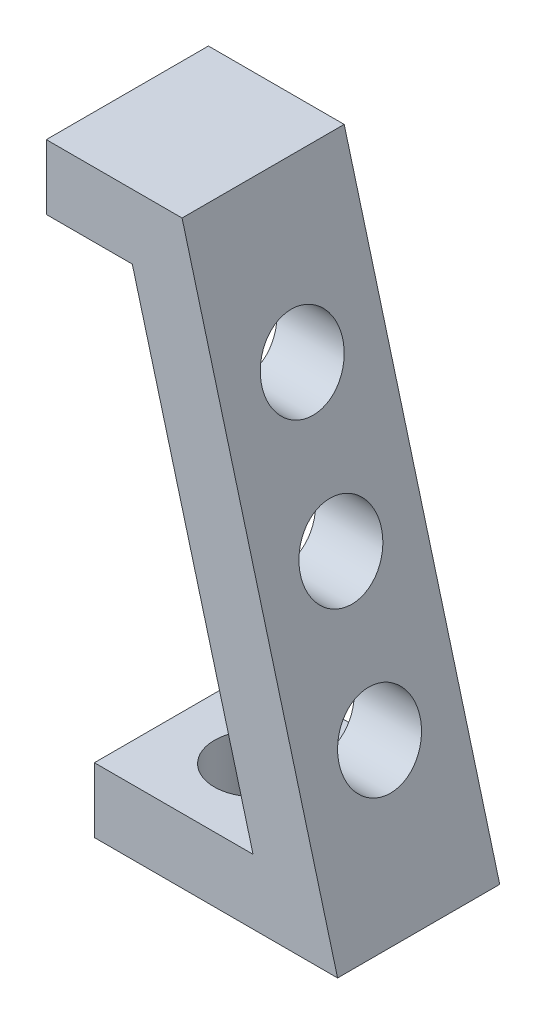
ISO-10303-21;
HEADER;
FILE_DESCRIPTION(('STEP AP214'),'2;1');
FILE_NAME('part.step','',(''),(''),'','','');
FILE_SCHEMA(('AUTOMOTIVE_DESIGN { 1 0 10303 214 1 1 1 1 }'));
ENDSEC;
DATA;
#1=APPLICATION_CONTEXT('core data for automotive mechanical design processes');
#2=APPLICATION_PROTOCOL_DEFINITION('international standard','automotive_design',2000,#1);
#3=PRODUCT_CONTEXT('',#1,'mechanical');
#4=PRODUCT('Part','Part','',(#3));
#5=PRODUCT_RELATED_PRODUCT_CATEGORY('part','',(#4));
#6=PRODUCT_DEFINITION_FORMATION('','',#4);
#7=PRODUCT_DEFINITION_CONTEXT('part definition',#1,'design');
#8=PRODUCT_DEFINITION('design','',#6,#7);
#9=PRODUCT_DEFINITION_SHAPE('','',#8);
#10=(LENGTH_UNIT() NAMED_UNIT(*) SI_UNIT(.MILLI.,.METRE.));
#11=(NAMED_UNIT(*) PLANE_ANGLE_UNIT() SI_UNIT($,.RADIAN.));
#12=(NAMED_UNIT(*) SI_UNIT($,.STERADIAN.) SOLID_ANGLE_UNIT());
#13=UNCERTAINTY_MEASURE_WITH_UNIT(LENGTH_MEASURE(1.E-05),#10,'distance_accuracy_value','');
#14=(GEOMETRIC_REPRESENTATION_CONTEXT(3) GLOBAL_UNCERTAINTY_ASSIGNED_CONTEXT((#13)) GLOBAL_UNIT_ASSIGNED_CONTEXT((#10,
#11,#12)) REPRESENTATION_CONTEXT('',''));
#15=CARTESIAN_POINT('',(0.,0.,0.));
#16=DIRECTION('',(0.,0.,1.));
#17=DIRECTION('',(1.,0.,0.));
#18=AXIS2_PLACEMENT_3D('',#15,#16,#17);
#19=CARTESIAN_POINT('',(-6.06896551724138,0.,10.));
#20=DIRECTION('',(1.,0.,0.));
#21=DIRECTION('',(0.,0.,-1.));
#22=AXIS2_PLACEMENT_3D('',#19,#20,#21);
#23=PLANE('',#22);
#24=DIRECTION('',(0.,-1.,0.));
#25=VECTOR('',#24,1.);
#26=CARTESIAN_POINT('',(-6.06896551724138,0.,0.));
#27=LINE('',#26,#25);
#28=CARTESIAN_POINT('',(-6.06896551724138,0.,0.));
#29=VERTEX_POINT('',#28);
#30=CARTESIAN_POINT('',(-6.06896551724138,-4.,0.));
#31=VERTEX_POINT('',#30);
#32=EDGE_CURVE('E132',#29,#31,#27,.T.);
#33=ORIENTED_EDGE('',*,*,#32,.T.);
#34=DIRECTION('',(0.,0.,-1.));
#35=VECTOR('',#34,1.);
#36=CARTESIAN_POINT('',(-6.06896551724138,-4.,10.));
#37=LINE('',#36,#35);
#38=CARTESIAN_POINT('',(-6.06896551724138,-4.,10.));
#39=VERTEX_POINT('',#38);
#40=EDGE_CURVE('E11',#39,#31,#37,.T.);
#41=ORIENTED_EDGE('',*,*,#40,.F.);
#42=DIRECTION('',(0.,-1.,0.));
#43=VECTOR('',#42,1.);
#44=CARTESIAN_POINT('',(-6.06896551724138,0.,10.));
#45=LINE('',#44,#43);
#46=CARTESIAN_POINT('',(-6.06896551724138,0.,10.));
#47=VERTEX_POINT('',#46);
#48=EDGE_CURVE('E147',#47,#39,#45,.T.);
#49=ORIENTED_EDGE('',*,*,#48,.F.);
#50=DIRECTION('',(0.,0.,-1.));
#51=VECTOR('',#50,1.);
#52=CARTESIAN_POINT('',(-6.06896551724138,0.,10.));
#53=LINE('',#52,#51);
#54=EDGE_CURVE('E128',#47,#29,#53,.T.);
#55=ORIENTED_EDGE('',*,*,#54,.T.);
#56=EDGE_LOOP('',(#33,#41,#49,#55));
#57=FACE_BOUND('',#56,.T.);
#58=ADVANCED_FACE('F34',(#57),#23,.F.);
#59=CARTESIAN_POINT('',(-6.06896551724138,-4.,10.));
#60=DIRECTION('',(0.,1.,0.));
#61=DIRECTION('',(-1.,0.,0.));
#62=AXIS2_PLACEMENT_3D('',#59,#60,#61);
#63=PLANE('',#62);
#64=CARTESIAN_POINT('',(-1.06896551724138,-4.,5.10048261217224));
#65=DIRECTION('',(0.,1.,0.));
#66=DIRECTION('',(-1.,0.,0.));
#67=AXIS2_PLACEMENT_3D('',#64,#65,#66);
#68=CIRCLE('',#67,2.5);
#69=CARTESIAN_POINT('',(-3.56896551724138,-4.,5.10048261217224));
#70=VERTEX_POINT('',#69);
#71=EDGE_CURVE('E162',#70,#70,#68,.T.);
#72=ORIENTED_EDGE('',*,*,#71,.T.);
#73=EDGE_LOOP('',(#72));
#74=FACE_BOUND('',#73,.T.);
#75=DIRECTION('',(1.,0.,0.));
#76=VECTOR('',#75,1.);
#77=CARTESIAN_POINT('',(-6.06896551724138,-4.,0.));
#78=LINE('',#77,#76);
#79=CARTESIAN_POINT('',(8.93103448275862,-4.,0.));
#80=VERTEX_POINT('',#79);
#81=EDGE_CURVE('E135',#31,#80,#78,.T.);
#82=ORIENTED_EDGE('',*,*,#81,.T.);
#83=DIRECTION('',(0.,0.,-1.));
#84=VECTOR('',#83,1.);
#85=CARTESIAN_POINT('',(8.93103448275862,-4.,10.));
#86=LINE('',#85,#84);
#87=CARTESIAN_POINT('',(8.93103448275862,-4.,10.));
#88=VERTEX_POINT('',#87);
#89=EDGE_CURVE('E43',#88,#80,#86,.T.);
#90=ORIENTED_EDGE('',*,*,#89,.F.);
#91=DIRECTION('',(1.,0.,0.));
#92=VECTOR('',#91,1.);
#93=CARTESIAN_POINT('',(-6.06896551724138,-4.,10.));
#94=LINE('',#93,#92);
#95=EDGE_CURVE('E95',#39,#88,#94,.T.);
#96=ORIENTED_EDGE('',*,*,#95,.F.);
#97=ORIENTED_EDGE('',*,*,#40,.T.);
#98=EDGE_LOOP('',(#82,#90,#96,#97));
#99=FACE_BOUND('',#98,.T.);
#100=ADVANCED_FACE('F215',(#74,#99),#63,.F.);
#101=CARTESIAN_POINT('',(8.93103448275862,-4.,10.));
#102=DIRECTION('',(-0.965925826289068,-0.258819045102522,0.));
#103=DIRECTION('',(0.258819045102522,-0.965925826289068,0.));
#104=AXIS2_PLACEMENT_3D('',#101,#102,#103);
#105=PLANE('',#104);
#106=CARTESIAN_POINT('',(1.74937042541491,22.8023351448979,5.));
#107=DIRECTION('',(-0.965925826289068,-0.258819045102522,0.));
#108=DIRECTION('',(0.258819045102522,-0.965925826289068,0.));
#109=AXIS2_PLACEMENT_3D('',#106,#107,#108);
#110=ELLIPSE('',#109,2.58819045102521,2.5);
#111=CARTESIAN_POINT('',(2.41924340649272,20.3023351448979,5.));
#112=VERTEX_POINT('',#111);
#113=EDGE_CURVE('E136',#112,#112,#110,.F.);
#114=ORIENTED_EDGE('',*,*,#113,.F.);
#115=EDGE_LOOP('',(#114));
#116=FACE_BOUND('',#115,.T.);
#117=CARTESIAN_POINT('',(6.5194917508785,5.,5.));
#118=DIRECTION('',(-0.965925826289068,-0.258819045102522,0.));
#119=DIRECTION('',(0.258819045102522,-0.965925826289068,0.));
#120=AXIS2_PLACEMENT_3D('',#117,#118,#119);
#121=ELLIPSE('',#120,2.58819045102521,2.5);
#122=CARTESIAN_POINT('',(7.18936473195631,2.5,5.));
#123=VERTEX_POINT('',#122);
#124=EDGE_CURVE('E165',#123,#123,#121,.F.);
#125=ORIENTED_EDGE('',*,*,#124,.F.);
#126=EDGE_LOOP('',(#125));
#127=FACE_BOUND('',#126,.T.);
#128=CARTESIAN_POINT('',(4.13474393824151,13.9,5.));
#129=DIRECTION('',(-0.965925826289068,-0.258819045102522,0.));
#130=DIRECTION('',(0.258819045102522,-0.965925826289068,0.));
#131=AXIS2_PLACEMENT_3D('',#128,#129,#130);
#132=ELLIPSE('',#131,2.58819045102521,2.5);
#133=CARTESIAN_POINT('',(4.80461691931931,11.4,5.));
#134=VERTEX_POINT('',#133);
#135=EDGE_CURVE('E161',#134,#134,#132,.F.);
#136=ORIENTED_EDGE('',*,*,#135,.F.);
#137=EDGE_LOOP('',(#136));
#138=FACE_BOUND('',#137,.T.);
#139=DIRECTION('',(-0.258819045102522,0.965925826289068,0.));
#140=VECTOR('',#139,1.);
#141=CARTESIAN_POINT('',(8.93103448275862,-4.,0.));
#142=LINE('',#141,#140);
#143=CARTESIAN_POINT('',(-0.661546606275615,31.8,0.));
#144=VERTEX_POINT('',#143);
#145=EDGE_CURVE('E138',#80,#144,#142,.T.);
#146=ORIENTED_EDGE('',*,*,#145,.T.);
#147=DIRECTION('',(0.,0.,-1.));
#148=VECTOR('',#147,1.);
#149=CARTESIAN_POINT('',(-0.661546606275615,31.8,10.));
#150=LINE('',#149,#148);
#151=CARTESIAN_POINT('',(-0.661546606275615,31.8,10.));
#152=VERTEX_POINT('',#151);
#153=EDGE_CURVE('E154',#152,#144,#150,.T.);
#154=ORIENTED_EDGE('',*,*,#153,.F.);
#155=DIRECTION('',(-0.258819045102522,0.965925826289068,0.));
#156=VECTOR('',#155,1.);
#157=CARTESIAN_POINT('',(8.93103448275862,-4.,10.));
#158=LINE('',#157,#156);
#159=EDGE_CURVE('E181',#88,#152,#158,.T.);
#160=ORIENTED_EDGE('',*,*,#159,.F.);
#161=ORIENTED_EDGE('',*,*,#89,.T.);
#162=EDGE_LOOP('',(#146,#154,#160,#161));
#163=FACE_BOUND('',#162,.T.);
#164=ADVANCED_FACE('F219',(#116,#127,#138,#163),#105,.F.);
#165=CARTESIAN_POINT('',(-0.661546606275615,31.8,10.));
#166=DIRECTION('',(0.,-1.,0.));
#167=DIRECTION('',(0.,0.,-1.));
#168=AXIS2_PLACEMENT_3D('',#165,#166,#167);
#169=PLANE('',#168);
#170=DIRECTION('',(-1.,0.,0.));
#171=VECTOR('',#170,1.);
#172=CARTESIAN_POINT('',(-0.661546606275615,31.8,0.));
#173=LINE('',#172,#171);
#174=CARTESIAN_POINT('',(-9.03616372266432,31.8,0.));
#175=VERTEX_POINT('',#174);
#176=EDGE_CURVE('E140',#144,#175,#173,.T.);
#177=ORIENTED_EDGE('',*,*,#176,.T.);
#178=DIRECTION('',(0.,0.,-1.));
#179=VECTOR('',#178,1.);
#180=CARTESIAN_POINT('',(-9.03616372266432,31.8,10.));
#181=LINE('',#180,#179);
#182=CARTESIAN_POINT('',(-9.03616372266432,31.8,10.));
#183=VERTEX_POINT('',#182);
#184=EDGE_CURVE('E151',#183,#175,#181,.T.);
#185=ORIENTED_EDGE('',*,*,#184,.F.);
#186=DIRECTION('',(-1.,0.,0.));
#187=VECTOR('',#186,1.);
#188=CARTESIAN_POINT('',(-0.661546606275615,31.8,10.));
#189=LINE('',#188,#187);
#190=EDGE_CURVE('E183',#152,#183,#189,.T.);
#191=ORIENTED_EDGE('',*,*,#190,.F.);
#192=ORIENTED_EDGE('',*,*,#153,.T.);
#193=EDGE_LOOP('',(#177,#185,#191,#192));
#194=FACE_BOUND('',#193,.T.);
#195=ADVANCED_FACE('F189',(#194),#169,.F.);
#196=CARTESIAN_POINT('',(-9.03616372266432,31.8,10.));
#197=DIRECTION('',(1.,0.,0.));
#198=DIRECTION('',(0.,0.,-1.));
#199=AXIS2_PLACEMENT_3D('',#196,#197,#198);
#200=PLANE('',#199);
#201=DIRECTION('',(0.,-1.,0.));
#202=VECTOR('',#201,1.);
#203=CARTESIAN_POINT('',(-9.03616372266432,31.8,0.));
#204=LINE('',#203,#202);
#205=CARTESIAN_POINT('',(-9.03616372266432,27.8023351448979,0.));
#206=VERTEX_POINT('',#205);
#207=EDGE_CURVE('E142',#175,#206,#204,.T.);
#208=ORIENTED_EDGE('',*,*,#207,.T.);
#209=DIRECTION('',(0.,0.,-1.));
#210=VECTOR('',#209,1.);
#211=CARTESIAN_POINT('',(-9.03616372266432,27.8023351448979,10.));
#212=LINE('',#211,#210);
#213=CARTESIAN_POINT('',(-9.03616372266432,27.8023351448979,10.));
#214=VERTEX_POINT('',#213);
#215=EDGE_CURVE('E123',#214,#206,#212,.T.);
#216=ORIENTED_EDGE('',*,*,#215,.F.);
#217=DIRECTION('',(0.,-1.,0.));
#218=VECTOR('',#217,1.);
#219=CARTESIAN_POINT('',(-9.03616372266432,31.8,10.));
#220=LINE('',#219,#218);
#221=EDGE_CURVE('E114',#183,#214,#220,.T.);
#222=ORIENTED_EDGE('',*,*,#221,.F.);
#223=ORIENTED_EDGE('',*,*,#184,.T.);
#224=EDGE_LOOP('',(#208,#216,#222,#223));
#225=FACE_BOUND('',#224,.T.);
#226=ADVANCED_FACE('F193',(#225),#200,.F.);
#227=CARTESIAN_POINT('',(-9.03616372266432,27.8023351448979,10.));
#228=DIRECTION('',(0.,1.,0.));
#229=DIRECTION('',(-1.,0.,0.));
#230=AXIS2_PLACEMENT_3D('',#227,#228,#229);
#231=PLANE('',#230);
#232=DIRECTION('',(1.,0.,0.));
#233=VECTOR('',#232,1.);
#234=CARTESIAN_POINT('',(-9.03616372266432,27.8023351448979,0.));
#235=LINE('',#234,#233);
#236=CARTESIAN_POINT('',(-3.73148025838105,27.8023351448979,0.));
#237=VERTEX_POINT('',#236);
#238=EDGE_CURVE('E122',#206,#237,#235,.T.);
#239=ORIENTED_EDGE('',*,*,#238,.T.);
#240=DIRECTION('',(0.,0.,-1.));
#241=VECTOR('',#240,1.);
#242=CARTESIAN_POINT('',(-3.73148025838105,27.8023351448979,10.));
#243=LINE('',#242,#241);
#244=CARTESIAN_POINT('',(-3.73148025838105,27.8023351448979,10.));
#245=VERTEX_POINT('',#244);
#246=EDGE_CURVE('E119',#245,#237,#243,.T.);
#247=ORIENTED_EDGE('',*,*,#246,.F.);
#248=DIRECTION('',(1.,0.,0.));
#249=VECTOR('',#248,1.);
#250=CARTESIAN_POINT('',(-9.03616372266432,27.8023351448979,10.));
#251=LINE('',#250,#249);
#252=EDGE_CURVE('E108',#214,#245,#251,.T.);
#253=ORIENTED_EDGE('',*,*,#252,.F.);
#254=ORIENTED_EDGE('',*,*,#215,.T.);
#255=EDGE_LOOP('',(#239,#247,#253,#254));
#256=FACE_BOUND('',#255,.T.);
#257=ADVANCED_FACE('F120',(#256),#231,.F.);
#258=CARTESIAN_POINT('',(-3.73148025838105,27.8023351448979,10.));
#259=DIRECTION('',(0.965925826289068,0.258819045102522,0.));
#260=DIRECTION('',(-0.258819045102522,0.965925826289068,0.));
#261=AXIS2_PLACEMENT_3D('',#258,#259,#260);
#262=PLANE('',#261);
#263=CARTESIAN_POINT('',(-2.39173429622542,22.8023351448979,5.));
#264=DIRECTION('',(0.965925826289068,0.258819045102522,0.));
#265=DIRECTION('',(0.258819045102522,-0.965925826289068,0.));
#266=AXIS2_PLACEMENT_3D('',#263,#264,#265);
#267=ELLIPSE('',#266,2.58819045102521,2.5);
#268=CARTESIAN_POINT('',(-1.72186131514761,20.3023351448979,5.));
#269=VERTEX_POINT('',#268);
#270=EDGE_CURVE('E37',#269,#269,#267,.F.);
#271=ORIENTED_EDGE('',*,*,#270,.F.);
#272=EDGE_LOOP('',(#271));
#273=FACE_BOUND('',#272,.T.);
#274=CARTESIAN_POINT('',(2.37838702923817,5.,5.));
#275=DIRECTION('',(0.965925826289068,0.258819045102522,0.));
#276=DIRECTION('',(0.258819045102522,-0.965925826289068,0.));
#277=AXIS2_PLACEMENT_3D('',#274,#275,#276);
#278=ELLIPSE('',#277,2.58819045102521,2.5);
#279=CARTESIAN_POINT('',(3.04826001031598,2.5,5.));
#280=VERTEX_POINT('',#279);
#281=EDGE_CURVE('E163',#280,#280,#278,.F.);
#282=ORIENTED_EDGE('',*,*,#281,.F.);
#283=EDGE_LOOP('',(#282));
#284=FACE_BOUND('',#283,.T.);
#285=CARTESIAN_POINT('',(-0.00636078339882884,13.9,5.));
#286=DIRECTION('',(0.965925826289068,0.258819045102522,0.));
#287=DIRECTION('',(0.258819045102522,-0.965925826289068,0.));
#288=AXIS2_PLACEMENT_3D('',#285,#286,#287);
#289=ELLIPSE('',#288,2.58819045102521,2.5);
#290=CARTESIAN_POINT('',(0.663512197678981,11.4,5.));
#291=VERTEX_POINT('',#290);
#292=EDGE_CURVE('E159',#291,#291,#289,.F.);
#293=ORIENTED_EDGE('',*,*,#292,.F.);
#294=EDGE_LOOP('',(#293));
#295=FACE_BOUND('',#294,.T.);
#296=DIRECTION('',(0.258819045102522,-0.965925826289068,0.));
#297=VECTOR('',#296,1.);
#298=CARTESIAN_POINT('',(-3.73148025838105,27.8023351448979,0.));
#299=LINE('',#298,#297);
#300=CARTESIAN_POINT('',(3.71813299139379,0.,0.));
#301=VERTEX_POINT('',#300);
#302=EDGE_CURVE('E81',#237,#301,#299,.T.);
#303=ORIENTED_EDGE('',*,*,#302,.T.);
#304=DIRECTION('',(0.,0.,-1.));
#305=VECTOR('',#304,1.);
#306=CARTESIAN_POINT('',(3.71813299139379,0.,10.));
#307=LINE('',#306,#305);
#308=CARTESIAN_POINT('',(3.71813299139379,0.,10.));
#309=VERTEX_POINT('',#308);
#310=EDGE_CURVE('E124',#309,#301,#307,.T.);
#311=ORIENTED_EDGE('',*,*,#310,.F.);
#312=DIRECTION('',(0.258819045102522,-0.965925826289068,0.));
#313=VECTOR('',#312,1.);
#314=CARTESIAN_POINT('',(-3.73148025838105,27.8023351448979,10.));
#315=LINE('',#314,#313);
#316=EDGE_CURVE('E112',#245,#309,#315,.T.);
#317=ORIENTED_EDGE('',*,*,#316,.F.);
#318=ORIENTED_EDGE('',*,*,#246,.T.);
#319=EDGE_LOOP('',(#303,#311,#317,#318));
#320=FACE_BOUND('',#319,.T.);
#321=ADVANCED_FACE('F126',(#273,#284,#295,#320),#262,.F.);
#322=CARTESIAN_POINT('',(3.71813299139379,0.,10.));
#323=DIRECTION('',(0.,-1.,0.));
#324=DIRECTION('',(1.,0.,0.));
#325=AXIS2_PLACEMENT_3D('',#322,#323,#324);
#326=PLANE('',#325);
#327=CARTESIAN_POINT('',(-1.06896551724138,0.,5.10048261217224));
#328=DIRECTION('',(0.,1.,0.));
#329=DIRECTION('',(-1.,0.,0.));
#330=AXIS2_PLACEMENT_3D('',#327,#328,#329);
#331=CIRCLE('',#330,2.5);
#332=CARTESIAN_POINT('',(-3.56896551724138,0.,5.10048261217224));
#333=VERTEX_POINT('',#332);
#334=EDGE_CURVE('E311',#333,#333,#331,.T.);
#335=ORIENTED_EDGE('',*,*,#334,.F.);
#336=EDGE_LOOP('',(#335));
#337=FACE_BOUND('',#336,.T.);
#338=DIRECTION('',(-1.,0.,0.));
#339=VECTOR('',#338,1.);
#340=CARTESIAN_POINT('',(3.71813299139379,0.,0.));
#341=LINE('',#340,#339);
#342=EDGE_CURVE('E87',#301,#29,#341,.T.);
#343=ORIENTED_EDGE('',*,*,#342,.T.);
#344=ORIENTED_EDGE('',*,*,#54,.F.);
#345=DIRECTION('',(-1.,0.,0.));
#346=VECTOR('',#345,1.);
#347=CARTESIAN_POINT('',(3.71813299139379,0.,10.));
#348=LINE('',#347,#346);
#349=EDGE_CURVE('E52',#309,#47,#348,.T.);
#350=ORIENTED_EDGE('',*,*,#349,.F.);
#351=ORIENTED_EDGE('',*,*,#310,.T.);
#352=EDGE_LOOP('',(#343,#344,#350,#351));
#353=FACE_BOUND('',#352,.T.);
#354=ADVANCED_FACE('F201',(#337,#353),#326,.F.);
#355=CARTESIAN_POINT('',(0.,0.,10.));
#356=DIRECTION('',(0.,0.,1.));
#357=DIRECTION('',(1.,0.,0.));
#358=AXIS2_PLACEMENT_3D('',#355,#356,#357);
#359=PLANE('',#358);
#360=ORIENTED_EDGE('',*,*,#48,.T.);
#361=ORIENTED_EDGE('',*,*,#95,.T.);
#362=ORIENTED_EDGE('',*,*,#159,.T.);
#363=ORIENTED_EDGE('',*,*,#190,.T.);
#364=ORIENTED_EDGE('',*,*,#221,.T.);
#365=ORIENTED_EDGE('',*,*,#252,.T.);
#366=ORIENTED_EDGE('',*,*,#316,.T.);
#367=ORIENTED_EDGE('',*,*,#349,.T.);
#368=EDGE_LOOP('',(#360,#361,#362,#363,#364,#365,#366,#367));
#369=FACE_BOUND('',#368,.T.);
#370=ADVANCED_FACE('F110',(#369),#359,.T.);
#371=CARTESIAN_POINT('',(0.,0.,0.));
#372=DIRECTION('',(0.,0.,1.));
#373=DIRECTION('',(1.,0.,0.));
#374=AXIS2_PLACEMENT_3D('',#371,#372,#373);
#375=PLANE('',#374);
#376=ORIENTED_EDGE('',*,*,#32,.F.);
#377=ORIENTED_EDGE('',*,*,#342,.F.);
#378=ORIENTED_EDGE('',*,*,#302,.F.);
#379=ORIENTED_EDGE('',*,*,#238,.F.);
#380=ORIENTED_EDGE('',*,*,#207,.F.);
#381=ORIENTED_EDGE('',*,*,#176,.F.);
#382=ORIENTED_EDGE('',*,*,#145,.F.);
#383=ORIENTED_EDGE('',*,*,#81,.F.);
#384=EDGE_LOOP('',(#376,#377,#378,#379,#380,#381,#382,#383));
#385=FACE_BOUND('',#384,.T.);
#386=ADVANCED_FACE('F196',(#385),#375,.F.);
#387=CARTESIAN_POINT('',(-16.0689655172414,13.9,5.));
#388=DIRECTION('',(1.,0.,0.));
#389=DIRECTION('',(0.,0.,-1.));
#390=AXIS2_PLACEMENT_3D('',#387,#388,#389);
#391=CYLINDRICAL_SURFACE('',#390,2.5);
#392=ORIENTED_EDGE('',*,*,#292,.T.);
#393=EDGE_LOOP('',(#392));
#394=FACE_BOUND('',#393,.T.);
#395=ORIENTED_EDGE('',*,*,#135,.T.);
#396=EDGE_LOOP('',(#395));
#397=FACE_BOUND('',#396,.T.);
#398=ADVANCED_FACE('F252',(#394,#397),#391,.F.);
#399=CARTESIAN_POINT('',(-16.0689655172414,5.,5.));
#400=DIRECTION('',(1.,0.,0.));
#401=DIRECTION('',(0.,0.,-1.));
#402=AXIS2_PLACEMENT_3D('',#399,#400,#401);
#403=CYLINDRICAL_SURFACE('',#402,2.5);
#404=ORIENTED_EDGE('',*,*,#281,.T.);
#405=EDGE_LOOP('',(#404));
#406=FACE_BOUND('',#405,.T.);
#407=ORIENTED_EDGE('',*,*,#124,.T.);
#408=EDGE_LOOP('',(#407));
#409=FACE_BOUND('',#408,.T.);
#410=ADVANCED_FACE('F257',(#406,#409),#403,.F.);
#411=CARTESIAN_POINT('',(-16.0689655172414,22.8023351448979,5.));
#412=DIRECTION('',(1.,0.,0.));
#413=DIRECTION('',(0.,0.,-1.));
#414=AXIS2_PLACEMENT_3D('',#411,#412,#413);
#415=CYLINDRICAL_SURFACE('',#414,2.5);
#416=ORIENTED_EDGE('',*,*,#270,.T.);
#417=EDGE_LOOP('',(#416));
#418=FACE_BOUND('',#417,.T.);
#419=ORIENTED_EDGE('',*,*,#113,.T.);
#420=EDGE_LOOP('',(#419));
#421=FACE_BOUND('',#420,.T.);
#422=ADVANCED_FACE('F269',(#418,#421),#415,.F.);
#423=CARTESIAN_POINT('',(-1.06896551724138,-15.,5.10048261217224));
#424=DIRECTION('',(0.,1.,0.));
#425=DIRECTION('',(-1.,0.,0.));
#426=AXIS2_PLACEMENT_3D('',#423,#424,#425);
#427=CYLINDRICAL_SURFACE('',#426,2.5);
#428=ORIENTED_EDGE('',*,*,#334,.T.);
#429=EDGE_LOOP('',(#428));
#430=FACE_BOUND('',#429,.T.);
#431=ORIENTED_EDGE('',*,*,#71,.F.);
#432=EDGE_LOOP('',(#431));
#433=FACE_BOUND('',#432,.T.);
#434=ADVANCED_FACE('F277',(#430,#433),#427,.F.);
#435=CLOSED_SHELL('',(#58,#100,#164,#195,#226,#257,#321,#354,#370,#386,#398,#410,#422,#434));
#436=MANIFOLD_SOLID_BREP('B2',#435);
#437=ADVANCED_BREP_SHAPE_REPRESENTATION('',(#18,#436),#14);
#438=SHAPE_DEFINITION_REPRESENTATION(#9,#437);
ENDSEC;
END-ISO-10303-21;
